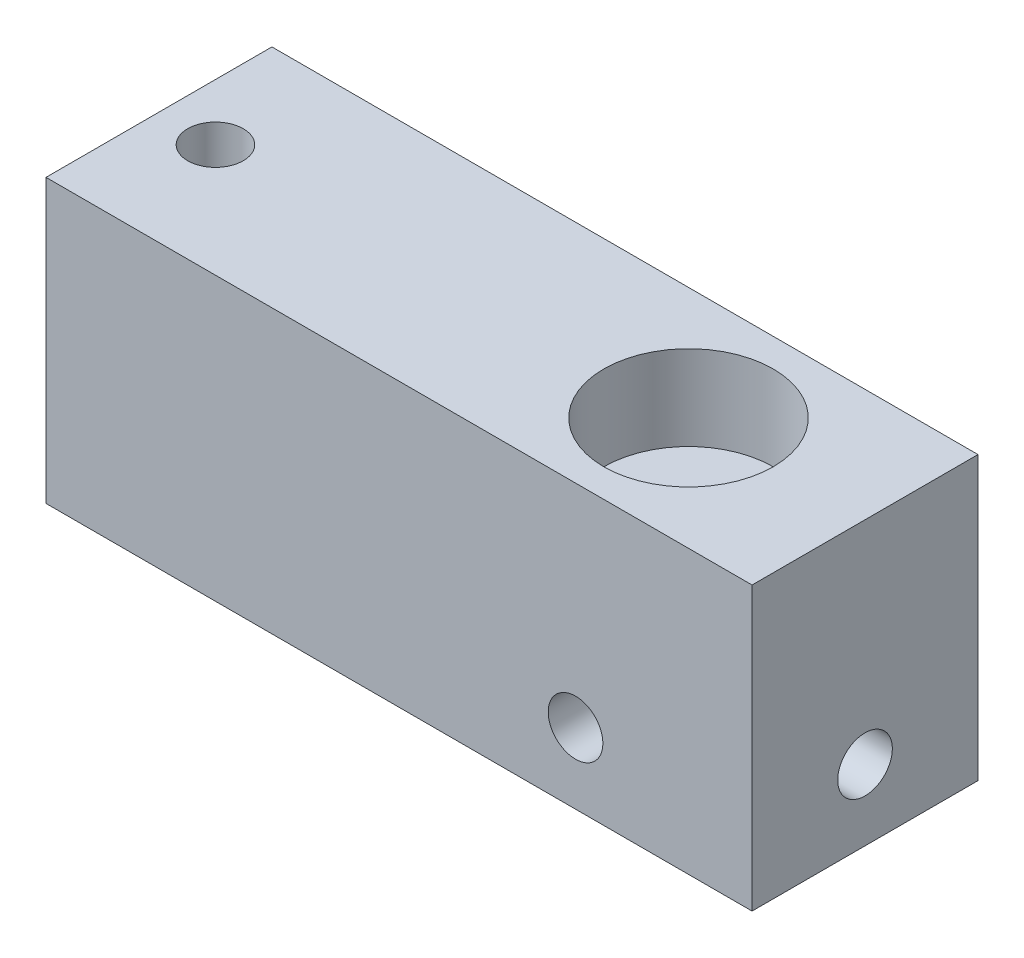
ISO-10303-21;
HEADER;
FILE_DESCRIPTION(('STEP AP214'),'2;1');
FILE_NAME('part.step','',(''),(''),'','','');
FILE_SCHEMA(('AUTOMOTIVE_DESIGN { 1 0 10303 214 1 1 1 1 }'));
ENDSEC;
DATA;
#1=APPLICATION_CONTEXT('core data for automotive mechanical design processes');
#2=APPLICATION_PROTOCOL_DEFINITION('international standard','automotive_design',2000,#1);
#3=PRODUCT_CONTEXT('',#1,'mechanical');
#4=PRODUCT('Part','Part','',(#3));
#5=PRODUCT_RELATED_PRODUCT_CATEGORY('part','',(#4));
#6=PRODUCT_DEFINITION_FORMATION('','',#4);
#7=PRODUCT_DEFINITION_CONTEXT('part definition',#1,'design');
#8=PRODUCT_DEFINITION('design','',#6,#7);
#9=PRODUCT_DEFINITION_SHAPE('','',#8);
#10=(LENGTH_UNIT() NAMED_UNIT(*) SI_UNIT(.MILLI.,.METRE.));
#11=(NAMED_UNIT(*) PLANE_ANGLE_UNIT() SI_UNIT($,.RADIAN.));
#12=(NAMED_UNIT(*) SI_UNIT($,.STERADIAN.) SOLID_ANGLE_UNIT());
#13=UNCERTAINTY_MEASURE_WITH_UNIT(LENGTH_MEASURE(1.E-05),#10,'distance_accuracy_value','');
#14=(GEOMETRIC_REPRESENTATION_CONTEXT(3) GLOBAL_UNCERTAINTY_ASSIGNED_CONTEXT((#13)) GLOBAL_UNIT_ASSIGNED_CONTEXT((#10,
#11,#12)) REPRESENTATION_CONTEXT('',''));
#15=CARTESIAN_POINT('',(0.,0.,0.));
#16=DIRECTION('',(0.,0.,1.));
#17=DIRECTION('',(1.,0.,0.));
#18=AXIS2_PLACEMENT_3D('',#15,#16,#17);
#19=CARTESIAN_POINT('',(-0.910267857142854,3.73883928571429,10.16));
#20=DIRECTION('',(0.,-1.,0.));
#21=DIRECTION('',(0.,0.,-1.));
#22=AXIS2_PLACEMENT_3D('',#19,#20,#21);
#23=CYLINDRICAL_SURFACE('',#22,3.175);
#24=CARTESIAN_POINT('',(1.54718214285713,-15.3111607142857,12.1703642698526));
#25=CARTESIAN_POINT('',(1.54718181275024,-15.3676823497579,12.1703649683734));
#26=CARTESIAN_POINT('',(1.54522514140633,-15.4242076252246,12.1727644340537));
#27=CARTESIAN_POINT('',(1.53747012279216,-15.5365927301839,12.1821861210722));
#28=CARTESIAN_POINT('',(1.53167120631298,-15.592452459831,12.1892090273483));
#29=CARTESIAN_POINT('',(1.50869830991297,-15.7585324479113,12.2166527041013));
#30=CARTESIAN_POINT('',(1.48594940627436,-15.8669726716601,12.2434451083172));
#31=CARTESIAN_POINT('',(1.42122419982478,-16.0990755275608,12.3158154149691));
#32=CARTESIAN_POINT('',(1.37614326257761,-16.220923100369,12.3642108288672));
#33=CARTESIAN_POINT('',(1.26954430286978,-16.4530054198774,12.4696954253262));
#34=CARTESIAN_POINT('',(1.20800628233574,-16.5632258088707,12.5267951485181));
#35=CARTESIAN_POINT('',(1.06790229818835,-16.7748638133818,12.645178735735));
#36=CARTESIAN_POINT('',(0.988927195336862,-16.8759695671223,12.7065334745517));
#37=CARTESIAN_POINT('',(0.815539303335605,-17.0653277578176,12.8270889669899));
#38=CARTESIAN_POINT('',(0.721138015496104,-17.1535896787724,12.8862912854954));
#39=CARTESIAN_POINT('',(0.521760241023555,-17.3121219252963,12.9958933587042));
#40=CARTESIAN_POINT('',(0.417432500968636,-17.3830133723543,13.0465659392274));
#41=CARTESIAN_POINT('',(0.195936098864364,-17.5092438739838,13.138466871536));
#42=CARTESIAN_POINT('',(0.0787797535257498,-17.5645976673465,13.1797041665821));
#43=CARTESIAN_POINT('',(-0.14759209202308,-17.6499021297176,13.2439289233957));
#44=CARTESIAN_POINT('',(-0.255311976421966,-17.6824338897152,13.2687367538486));
#45=CARTESIAN_POINT('',(-0.476096355974495,-17.7325948726575,13.30716458668));
#46=CARTESIAN_POINT('',(-0.589157354491618,-17.7502337065305,13.32079180414));
#47=CARTESIAN_POINT('',(-0.817798202355375,-17.7695557974694,13.3357254991741));
#48=CARTESIAN_POINT('',(-0.933384424817998,-17.7711924686407,13.3369960035208));
#49=CARTESIAN_POINT('',(-1.16310031506245,-17.7582762112873,13.3270052683012));
#50=CARTESIAN_POINT('',(-1.27722977294697,-17.7437209758075,13.31574224301));
#51=CARTESIAN_POINT('',(-1.49572235994868,-17.7003395955872,13.2824283262941));
#52=CARTESIAN_POINT('',(-1.60029429610973,-17.6721669451169,13.2608719334065));
#53=CARTESIAN_POINT('',(-1.80281173740431,-17.6032946275172,13.2087598596926));
#54=CARTESIAN_POINT('',(-1.90075569771828,-17.5625920521509,13.1782020896882));
#55=CARTESIAN_POINT('',(-2.09840787107985,-17.4654010966403,13.10637583643));
#56=CARTESIAN_POINT('',(-2.19723338097589,-17.4077085583546,13.064322362141));
#57=CARTESIAN_POINT('',(-2.38411648711467,-17.2808331353867,12.9741044526009));
#58=CARTESIAN_POINT('',(-2.4721662265054,-17.2116419524416,12.9259356100226));
#59=CARTESIAN_POINT('',(-2.65377850951626,-17.04812700028,12.8159781000162));
#60=CARTESIAN_POINT('',(-2.74483968305465,-16.9515518394978,12.7534080347511));
#61=CARTESIAN_POINT('',(-2.91037346971451,-16.7450973188708,12.6279898864689));
#62=CARTESIAN_POINT('',(-2.98483234117324,-16.6352070534094,12.5651416167352));
#63=CARTESIAN_POINT('',(-3.10546601838315,-16.4214198776669,12.455053633421));
#64=CARTESIAN_POINT('',(-3.15427252075817,-16.3194634354282,12.406939166591));
#65=CARTESIAN_POINT('',(-3.23826680723376,-16.1064724741469,12.319792384211));
#66=CARTESIAN_POINT('',(-3.27348504890555,-15.9954589414463,12.2807398360215));
#67=CARTESIAN_POINT('',(-3.32165504464854,-15.7931458110601,12.2256359596698));
#68=CARTESIAN_POINT('',(-3.33792951594114,-15.7035557822643,12.2063079675201));
#69=CARTESIAN_POINT('',(-3.36041494318394,-15.521446292728,12.1793385731337));
#70=CARTESIAN_POINT('',(-3.36664314363236,-15.4289321302829,12.1716771464191));
#71=CARTESIAN_POINT('',(-3.36853840123422,-15.2433734368542,12.1693620693368));
#72=CARTESIAN_POINT('',(-3.36417715394142,-15.1503281491021,12.1747432804578));
#73=CARTESIAN_POINT('',(-3.34522220233427,-14.9667662110988,12.1976032300238));
#74=CARTESIAN_POINT('',(-3.33061285881293,-14.8762536457542,12.2151004577082));
#75=CARTESIAN_POINT('',(-3.28587573723307,-14.6709158072219,12.2668000069231));
#76=CARTESIAN_POINT('',(-3.25224160738188,-14.5577837004325,12.3045886225015));
#77=CARTESIAN_POINT('',(-3.17094213953587,-14.3406254669564,12.3901263496192));
#78=CARTESIAN_POINT('',(-3.12323482130581,-14.2366278103736,12.4379051357969));
#79=CARTESIAN_POINT('',(-2.99636115029917,-14.0032827361763,12.5555545232503));
#80=CARTESIAN_POINT('',(-2.91202445057243,-13.8777040829759,12.6273278352968));
#81=CARTESIAN_POINT('',(-2.72180184216834,-13.6438018058425,12.7702025607316));
#82=CARTESIAN_POINT('',(-2.61592667788624,-13.5354696264048,12.8413042907027));
#83=CARTESIAN_POINT('',(-2.40281907822586,-13.3547797997635,12.9645371715887));
#84=CARTESIAN_POINT('',(-2.29881049376915,-13.279436090695,13.0178475885856));
#85=CARTESIAN_POINT('',(-2.07715957065448,-13.144552638518,13.1152630634093));
#86=CARTESIAN_POINT('',(-1.95953916682285,-13.0849879640301,13.1593826192387));
#87=CARTESIAN_POINT('',(-1.73273126550765,-12.992741108865,13.2285285117794));
#88=CARTESIAN_POINT('',(-1.62527784186029,-12.9572637798059,13.2554922262238));
#89=CARTESIAN_POINT('',(-1.4044045893124,-12.9012140057459,13.2983239604475));
#90=CARTESIAN_POINT('',(-1.29098804805586,-12.8806334382563,13.3141980267145));
#91=CARTESIAN_POINT('',(-1.0609125618707,-12.8555961496087,13.3335307489787));
#92=CARTESIAN_POINT('',(-0.94424375492629,-12.851195470467,13.3369462521315));
#93=CARTESIAN_POINT('',(-0.711798259285756,-12.8589793975095,13.3309228251952));
#94=CARTESIAN_POINT('',(-0.59602160329348,-12.8711646088066,13.321483426113));
#95=CARTESIAN_POINT('',(-0.375215260997357,-12.9101887809227,13.2914672844167));
#96=CARTESIAN_POINT('',(-0.269944724369463,-12.9361848559008,13.2715317026748));
#97=CARTESIAN_POINT('',(-0.0657076474663094,-13.0009083525549,13.2224152897288));
#98=CARTESIAN_POINT('',(0.0332574052026911,-13.0396387653696,13.193232286478));
#99=CARTESIAN_POINT('',(0.232178386727058,-13.1323949186795,13.124376465787));
#100=CARTESIAN_POINT('',(0.331372517150721,-13.1875072155717,13.0839810811025));
#101=CARTESIAN_POINT('',(0.519348676887477,-13.3092077651407,12.996824986875));
#102=CARTESIAN_POINT('',(0.608124091067142,-13.3758032432665,12.9500602735387));
#103=CARTESIAN_POINT('',(0.791342893161516,-13.5332574476837,12.8430052401881));
#104=CARTESIAN_POINT('',(0.883408866722775,-13.6263080805575,12.7818734993192));
#105=CARTESIAN_POINT('',(1.05153643664606,-13.8254291137312,12.6585622545501));
#106=CARTESIAN_POINT('',(1.12758292031463,-13.9315116602532,12.5963818205052));
#107=CARTESIAN_POINT('',(1.25513075678499,-14.1434264264437,12.4833767258052));
#108=CARTESIAN_POINT('',(1.30844326370184,-14.2479041738817,12.4320661195432));
#109=CARTESIAN_POINT('',(1.40060452304584,-14.4667706969318,12.3382567163752));
#110=CARTESIAN_POINT('',(1.43947607227724,-14.5811434970184,12.2957440782147));
#111=CARTESIAN_POINT('',(1.49500767753375,-14.79757333852,12.2328590689191));
#112=CARTESIAN_POINT('',(1.51441432397182,-14.8981133474535,12.2098722476481));
#113=CARTESIAN_POINT('',(1.53398870835175,-15.051658983825,12.1864078184885));
#114=CARTESIAN_POINT('',(1.53892409979709,-15.103256337521,12.1804226866419));
#115=CARTESIAN_POINT('',(1.54552024735433,-15.2069551561071,12.1724014608685));
#116=CARTESIAN_POINT('',(1.54718244716533,-15.2590563885577,12.1703636259231));
#117=CARTESIAN_POINT('',(1.54718214285713,-15.3111607142857,12.1703642698526));
#118=B_SPLINE_CURVE_WITH_KNOTS('',3,(#24,#25,#26,#27,#28,#29,#30,#31,#32,#33,#34,#35,#36,#37,
#38,#39,#40,#41,#42,#43,#44,#45,#46,#47,#48,#49,#50,#51,#52,#53,#54,#55,#56,#57,#58,#59,#60,#61,
#62,#63,#64,#65,#66,#67,#68,#69,#70,#71,#72,#73,#74,#75,#76,#77,#78,#79,#80,#81,#82,#83,#84,#85,
#86,#87,#88,#89,#90,#91,#92,#93,#94,#95,#96,#97,#98,#99,#100,#101,#102,#103,#104,#105,#106,#107,
#108,#109,#110,#111,#112,#113,#114,#115,#116,#117),.UNSPECIFIED.,.T.,.F.,(4,2,2,2,2,2,2,2,2,2,2,
2,2,2,2,2,2,2,2,2,2,2,2,2,2,2,2,2,2,2,2,2,2,2,2,2,2,2,2,2,2,2,2,2,2,2,4),(0.,0.169485062936671,
0.3389952398321,0.678841608818385,1.09256234605475,1.50678812483846,1.93202441328912,
2.35694509259097,2.7631540313288,3.16897633391103,3.51317462798851,3.8571506286712,
4.20212772372273,4.54715397595838,4.8770568685425,5.20703639048134,5.57145455308031,
5.93613685770948,6.37475343797258,6.81373172288627,7.18119024857467,7.54782027749966,
7.82595323378227,8.10360826278166,8.38200625016756,8.66083001639692,9.03054868934234,
9.40138157974831,9.90123236984671,10.400834419713,10.8164004558955,11.2313059142933,
11.5788100266513,11.9261245186815,12.2746408710013,12.6231699387899,12.9525283965772,
13.2819642719298,13.6419998512058,14.0022628043526,14.4340934255264,14.8663296265924,
15.2492122200182,15.6314877922239,15.9445817709082,16.1008901025948,16.2571294762702),.UNSPECIFIED.);
#119=CARTESIAN_POINT('',(1.33479617312565,-16.310534519473,12.4050640302661));
#120=VERTEX_POINT('',#119);
#121=CARTESIAN_POINT('',(1.33479617312443,-14.3117869090957,12.4050640302673));
#122=VERTEX_POINT('',#121);
#123=EDGE_CURVE('E11',#120,#122,#118,.T.);
#124=ORIENTED_EDGE('',*,*,#123,.F.);
#125=CARTESIAN_POINT('',(1.10009641270976,-15.3111607142857,7.70255000000001));
#126=CARTESIAN_POINT('',(1.1000971112305,-15.3676823497579,7.7025503301069));
#127=CARTESIAN_POINT('',(1.10249657691088,-15.4242076252246,7.70450700145081));
#128=CARTESIAN_POINT('',(1.11191826392931,-15.5365927301839,7.71226202006498));
#129=CARTESIAN_POINT('',(1.11894117020539,-15.592452459831,7.71806093654416));
#130=CARTESIAN_POINT('',(1.14638484695843,-15.7585324479113,7.74103383294417));
#131=CARTESIAN_POINT('',(1.17317725117438,-15.8669726716601,7.76378273658278));
#132=CARTESIAN_POINT('',(1.24554755782628,-16.0990755275608,7.82850794303236));
#133=CARTESIAN_POINT('',(1.29394297172437,-16.220923100369,7.87358888027953));
#134=CARTESIAN_POINT('',(1.39942756818333,-16.4530054198774,7.98018783998736));
#135=CARTESIAN_POINT('',(1.45652729137526,-16.5632258088707,8.0417258605214));
#136=CARTESIAN_POINT('',(1.57491087859215,-16.7748638133818,8.18182984466879));
#137=CARTESIAN_POINT('',(1.63626561740882,-16.8759695671223,8.26080494752028));
#138=CARTESIAN_POINT('',(1.75682110984703,-17.0653277578176,8.43419283952153));
#139=CARTESIAN_POINT('',(1.81602342835253,-17.1535896787724,8.52859412736103));
#140=CARTESIAN_POINT('',(1.92562550156129,-17.3121219252963,8.72797190183358));
#141=CARTESIAN_POINT('',(1.97629808208451,-17.3830133723543,8.8322996418885));
#142=CARTESIAN_POINT('',(2.06819901439313,-17.5092438739838,9.05379604399277));
#143=CARTESIAN_POINT('',(2.10943630943928,-17.5645976673465,9.17095238933139));
#144=CARTESIAN_POINT('',(2.17366106625282,-17.6499021297176,9.39732423488022));
#145=CARTESIAN_POINT('',(2.19846889670579,-17.6824338897152,9.5050441192791));
#146=CARTESIAN_POINT('',(2.23689672953717,-17.7325948726575,9.72582849883163));
#147=CARTESIAN_POINT('',(2.25052394699719,-17.7502337065305,9.83888949734875));
#148=CARTESIAN_POINT('',(2.26545764203122,-17.7695557974694,10.0675303452125));
#149=CARTESIAN_POINT('',(2.26672814637795,-17.7711924686408,10.1831165676751));
#150=CARTESIAN_POINT('',(2.25673741115833,-17.7582762112873,10.4128324579196));
#151=CARTESIAN_POINT('',(2.24547438586719,-17.7437209758076,10.5269619158041));
#152=CARTESIAN_POINT('',(2.2121604691513,-17.7003395955872,10.7454545028058));
#153=CARTESIAN_POINT('',(2.19060407626366,-17.6721669451169,10.8500264389669));
#154=CARTESIAN_POINT('',(2.13849200254978,-17.6032946275172,11.0525438802614));
#155=CARTESIAN_POINT('',(2.10793423254531,-17.5625920521509,11.1504878405754));
#156=CARTESIAN_POINT('',(2.03610797928717,-17.4654010966403,11.348140013937));
#157=CARTESIAN_POINT('',(1.99405450499812,-17.4077085583547,11.446965523833));
#158=CARTESIAN_POINT('',(1.90383659545809,-17.2808331353867,11.6338486299718));
#159=CARTESIAN_POINT('',(1.85566775287976,-17.2116419524416,11.7218983693625));
#160=CARTESIAN_POINT('',(1.74571024287337,-17.0481270002801,11.9035106523734));
#161=CARTESIAN_POINT('',(1.6831401776083,-16.9515518394978,11.9945718259118));
#162=CARTESIAN_POINT('',(1.55772202932604,-16.7450973188708,12.1601056125716));
#163=CARTESIAN_POINT('',(1.49487375959233,-16.6352070534094,12.2345644840304));
#164=CARTESIAN_POINT('',(1.38478577627814,-16.4214198776669,12.3551981612403));
#165=CARTESIAN_POINT('',(1.33667130944813,-16.3194634354282,12.4040046636153));
#166=CARTESIAN_POINT('',(1.24952452706812,-16.1064724741469,12.4879989500909));
#167=CARTESIAN_POINT('',(1.21047197887869,-15.9954589414463,12.5232171917627));
#168=CARTESIAN_POINT('',(1.15536810252695,-15.7931458110601,12.5713871875057));
#169=CARTESIAN_POINT('',(1.13604011037727,-15.7035557822644,12.5876616587983));
#170=CARTESIAN_POINT('',(1.10907071599082,-15.521446292728,12.6101470860411));
#171=CARTESIAN_POINT('',(1.10140928927625,-15.4289321302829,12.6163752864895));
#172=CARTESIAN_POINT('',(1.09909421219391,-15.2433734368542,12.6182705440914));
#173=CARTESIAN_POINT('',(1.10447542331495,-15.1503281491021,12.6139092967986));
#174=CARTESIAN_POINT('',(1.12733537288096,-14.9667662110989,12.5949543451914));
#175=CARTESIAN_POINT('',(1.14483260056537,-14.8762536457542,12.5803450016701));
#176=CARTESIAN_POINT('',(1.19653214978028,-14.6709158072219,12.5356078800902));
#177=CARTESIAN_POINT('',(1.2343207653586,-14.5577837004325,12.501973750239));
#178=CARTESIAN_POINT('',(1.31985849247633,-14.3406254669564,12.420674282393));
#179=CARTESIAN_POINT('',(1.36763727865404,-14.2366278103736,12.372966964163));
#180=CARTESIAN_POINT('',(1.4852866661074,-14.0032827361763,12.2460932931563));
#181=CARTESIAN_POINT('',(1.5570599781539,-13.8777040829759,12.1617565934296));
#182=CARTESIAN_POINT('',(1.69993470358877,-13.6438018058425,11.9715339850255));
#183=CARTESIAN_POINT('',(1.77103643355982,-13.5354696264048,11.8656588207434));
#184=CARTESIAN_POINT('',(1.8942693144458,-13.3547797997635,11.652551221083));
#185=CARTESIAN_POINT('',(1.9475797314427,-13.279436090695,11.5485426366263));
#186=CARTESIAN_POINT('',(2.04499520626648,-13.144552638518,11.3268917135116));
#187=CARTESIAN_POINT('',(2.08911476209588,-13.0849879640301,11.20927130968));
#188=CARTESIAN_POINT('',(2.15826065463649,-12.992741108865,10.9824634083648));
#189=CARTESIAN_POINT('',(2.18522436908093,-12.9572637798059,10.8750099847174));
#190=CARTESIAN_POINT('',(2.22805610330462,-12.9012140057459,10.6541367321696));
#191=CARTESIAN_POINT('',(2.24393016957162,-12.8806334382563,10.540720190913));
#192=CARTESIAN_POINT('',(2.26326289183585,-12.8555961496087,10.3106447047278));
#193=CARTESIAN_POINT('',(2.26667839498867,-12.851195470467,10.1939758977834));
#194=CARTESIAN_POINT('',(2.2606549680523,-12.8589793975095,9.96153040214291));
#195=CARTESIAN_POINT('',(2.25121556897011,-12.8711646088066,9.84575374615063));
#196=CARTESIAN_POINT('',(2.22119942727387,-12.9101887809227,9.62494740385451));
#197=CARTESIAN_POINT('',(2.20126384553199,-12.9361848559008,9.51967686722661));
#198=CARTESIAN_POINT('',(2.15214743258593,-13.0009083525549,9.31543979032346));
#199=CARTESIAN_POINT('',(2.12296442933514,-13.0396387653695,9.21647473765446));
#200=CARTESIAN_POINT('',(2.05410860864413,-13.1323949186795,9.01755375613009));
#201=CARTESIAN_POINT('',(2.01371322395964,-13.1875072155717,8.91835962570643));
#202=CARTESIAN_POINT('',(1.92655712973215,-13.3092077651407,8.73038346596967));
#203=CARTESIAN_POINT('',(1.87979241639589,-13.3758032432665,8.64160805179));
#204=CARTESIAN_POINT('',(1.7727373830452,-13.5332574476837,8.45838924969563));
#205=CARTESIAN_POINT('',(1.71160564217631,-13.6263080805575,8.36632327613437));
#206=CARTESIAN_POINT('',(1.58829439740727,-13.8254291137312,8.19819570621108));
#207=CARTESIAN_POINT('',(1.52611396336231,-13.9315116602532,8.12214922254251));
#208=CARTESIAN_POINT('',(1.41310886866237,-14.1434264264437,7.99460138607216));
#209=CARTESIAN_POINT('',(1.36179826240031,-14.2479041738817,7.9412888791553));
#210=CARTESIAN_POINT('',(1.26798885923234,-14.4667706969318,7.84912761981131));
#211=CARTESIAN_POINT('',(1.22547622107179,-14.5811434970183,7.8102560705799));
#212=CARTESIAN_POINT('',(1.16259121177627,-14.79757333852,7.75472446532339));
#213=CARTESIAN_POINT('',(1.13960439050523,-14.8981133474534,7.73531781888532));
#214=CARTESIAN_POINT('',(1.11613996134562,-15.051658983825,7.71574343450539));
#215=CARTESIAN_POINT('',(1.11015482949901,-15.103256337521,7.71080804306005));
#216=CARTESIAN_POINT('',(1.10213360372563,-15.2069551561071,7.70421189550281));
#217=CARTESIAN_POINT('',(1.1000957687802,-15.2590563885577,7.70254969569181));
#218=CARTESIAN_POINT('',(1.10009641270976,-15.3111607142857,7.70255000000001));
#219=B_SPLINE_CURVE_WITH_KNOTS('',3,(#125,#126,#127,#128,#129,#130,#131,#132,#133,#134,#135,
#136,#137,#138,#139,#140,#141,#142,#143,#144,#145,#146,#147,#148,#149,#150,#151,#152,#153,#154,
#155,#156,#157,#158,#159,#160,#161,#162,#163,#164,#165,#166,#167,#168,#169,#170,#171,#172,#173,
#174,#175,#176,#177,#178,#179,#180,#181,#182,#183,#184,#185,#186,#187,#188,#189,#190,#191,#192,
#193,#194,#195,#196,#197,#198,#199,#200,#201,#202,#203,#204,#205,#206,#207,#208,#209,#210,#211,
#212,#213,#214,#215,#216,#217,#218),.UNSPECIFIED.,.T.,.F.,(4,2,2,2,2,2,2,2,2,2,2,2,2,2,2,2,2,2,
2,2,2,2,2,2,2,2,2,2,2,2,2,2,2,2,2,2,2,2,2,2,2,2,2,2,2,2,4),(0.,0.16948506293667,
0.338995239832098,0.678841608818383,1.09256234605475,1.50678812483846,1.93202441328912,
2.35694509259097,2.76315403132881,3.16897633391103,3.51317462798851,3.8571506286712,
4.20212772372273,4.54715397595838,4.8770568685425,5.20703639048134,5.57145455308031,
5.93613685770949,6.37475343797259,6.81373172288627,7.18119024857467,7.54782027749966,
7.82595323378228,8.10360826278167,8.38200625016756,8.66083001639693,9.03054868934234,
9.40138157974832,9.90123236984672,10.400834419713,10.8164004558956,11.2313059142933,
11.5788100266513,11.9261245186816,12.2746408710013,12.6231699387899,12.9525283965772,
13.2819642719298,13.6419998512058,14.0022628043527,14.4340934255264,14.8663296265925,
15.2492122200182,15.6314877922239,15.9445817709082,16.1008901025948,16.2571294762703),.UNSPECIFIED.);
#220=EDGE_CURVE('E48',#122,#120,#219,.T.);
#221=ORIENTED_EDGE('',*,*,#220,.F.);
#222=EDGE_LOOP('',(#124,#221));
#223=FACE_BOUND('',#222,.T.);
#224=CARTESIAN_POINT('',(-0.910267857142854,-21.6611607142857,10.16));
#225=DIRECTION('',(0.,-1.,0.));
#226=DIRECTION('',(0.,0.,-1.));
#227=AXIS2_PLACEMENT_3D('',#224,#225,#226);
#228=CIRCLE('',#227,3.175);
#229=CARTESIAN_POINT('',(-0.910267857142854,-21.6611607142857,6.985));
#230=VERTEX_POINT('',#229);
#231=EDGE_CURVE('E112',#230,#230,#228,.T.);
#232=ORIENTED_EDGE('',*,*,#231,.T.);
#233=EDGE_LOOP('',(#232));
#234=FACE_BOUND('',#233,.T.);
#235=CARTESIAN_POINT('',(-0.910267857142854,-3.88116071428571,10.16));
#236=DIRECTION('',(0.,1.,0.));
#237=DIRECTION('',(0.,0.,1.));
#238=AXIS2_PLACEMENT_3D('',#235,#236,#237);
#239=CIRCLE('',#238,3.175);
#240=CARTESIAN_POINT('',(-0.910267857142854,-3.88116071428571,13.335));
#241=VERTEX_POINT('',#240);
#242=EDGE_CURVE('E37',#241,#241,#239,.F.);
#243=ORIENTED_EDGE('',*,*,#242,.F.);
#244=EDGE_LOOP('',(#243));
#245=FACE_BOUND('',#244,.T.);
#246=ADVANCED_FACE('F33',(#223,#234,#245),#23,.F.);
#247=CARTESIAN_POINT('',(-48.5352678571429,3.73883928571428,20.32));
#248=DIRECTION('',(1.,0.,0.));
#249=DIRECTION('',(0.,0.,-1.));
#250=AXIS2_PLACEMENT_3D('',#247,#248,#249);
#251=PLANE('',#250);
#252=DIRECTION('',(0.,-1.,0.));
#253=VECTOR('',#252,1.);
#254=CARTESIAN_POINT('',(-48.5352678571429,3.73883928571428,0.));
#255=LINE('',#254,#253);
#256=CARTESIAN_POINT('',(-48.5352678571429,3.73883928571428,0.));
#257=VERTEX_POINT('',#256);
#258=CARTESIAN_POINT('',(-48.5352678571429,-21.6611607142857,0.));
#259=VERTEX_POINT('',#258);
#260=EDGE_CURVE('E153',#257,#259,#255,.T.);
#261=ORIENTED_EDGE('',*,*,#260,.T.);
#262=DIRECTION('',(0.,0.,-1.));
#263=VECTOR('',#262,1.);
#264=CARTESIAN_POINT('',(-48.5352678571429,-21.6611607142857,20.32));
#265=LINE('',#264,#263);
#266=CARTESIAN_POINT('',(-48.5352678571429,-21.6611607142857,20.32));
#267=VERTEX_POINT('',#266);
#268=EDGE_CURVE('E138',#267,#259,#265,.T.);
#269=ORIENTED_EDGE('',*,*,#268,.F.);
#270=DIRECTION('',(0.,-1.,0.));
#271=VECTOR('',#270,1.);
#272=CARTESIAN_POINT('',(-48.5352678571429,3.73883928571428,20.32));
#273=LINE('',#272,#271);
#274=CARTESIAN_POINT('',(-48.5352678571429,3.73883928571428,20.32));
#275=VERTEX_POINT('',#274);
#276=EDGE_CURVE('E148',#275,#267,#273,.T.);
#277=ORIENTED_EDGE('',*,*,#276,.F.);
#278=DIRECTION('',(0.,0.,-1.));
#279=VECTOR('',#278,1.);
#280=CARTESIAN_POINT('',(-48.5352678571429,3.73883928571428,20.32));
#281=LINE('',#280,#279);
#282=EDGE_CURVE('E145',#275,#257,#281,.T.);
#283=ORIENTED_EDGE('',*,*,#282,.T.);
#284=EDGE_LOOP('',(#261,#269,#277,#283));
#285=FACE_BOUND('',#284,.T.);
#286=ADVANCED_FACE('F35',(#285),#251,.F.);
#287=CARTESIAN_POINT('',(-48.5352678571429,-21.6611607142857,20.32));
#288=DIRECTION('',(0.,1.,0.));
#289=DIRECTION('',(0.,0.,1.));
#290=AXIS2_PLACEMENT_3D('',#287,#288,#289);
#291=PLANE('',#290);
#292=ORIENTED_EDGE('',*,*,#231,.F.);
#293=EDGE_LOOP('',(#292));
#294=FACE_BOUND('',#293,.T.);
#295=DIRECTION('',(1.,0.,0.));
#296=VECTOR('',#295,1.);
#297=CARTESIAN_POINT('',(-48.5352678571429,-21.6611607142857,0.));
#298=LINE('',#297,#296);
#299=CARTESIAN_POINT('',(14.9647321428571,-21.6611607142857,0.));
#300=VERTEX_POINT('',#299);
#301=EDGE_CURVE('E151',#259,#300,#298,.T.);
#302=ORIENTED_EDGE('',*,*,#301,.T.);
#303=DIRECTION('',(0.,0.,-1.));
#304=VECTOR('',#303,1.);
#305=CARTESIAN_POINT('',(14.9647321428571,-21.6611607142857,20.32));
#306=LINE('',#305,#304);
#307=CARTESIAN_POINT('',(14.9647321428571,-21.6611607142857,20.32));
#308=VERTEX_POINT('',#307);
#309=EDGE_CURVE('E140',#308,#300,#306,.T.);
#310=ORIENTED_EDGE('',*,*,#309,.F.);
#311=DIRECTION('',(1.,0.,0.));
#312=VECTOR('',#311,1.);
#313=CARTESIAN_POINT('',(-48.5352678571429,-21.6611607142857,20.32));
#314=LINE('',#313,#312);
#315=EDGE_CURVE('E85',#267,#308,#314,.T.);
#316=ORIENTED_EDGE('',*,*,#315,.F.);
#317=ORIENTED_EDGE('',*,*,#268,.T.);
#318=EDGE_LOOP('',(#302,#310,#316,#317));
#319=FACE_BOUND('',#318,.T.);
#320=ADVANCED_FACE('F177',(#294,#319),#291,.F.);
#321=CARTESIAN_POINT('',(14.9647321428571,3.73883928571428,20.32));
#322=DIRECTION('',(-1.,0.,0.));
#323=DIRECTION('',(0.,-1.,0.));
#324=AXIS2_PLACEMENT_3D('',#321,#322,#323);
#325=PLANE('',#324);
#326=CARTESIAN_POINT('',(14.9647321428571,-15.3111607142857,10.16));
#327=DIRECTION('',(1.,0.,0.));
#328=DIRECTION('',(0.,0.,-1.));
#329=AXIS2_PLACEMENT_3D('',#326,#327,#328);
#330=CIRCLE('',#329,2.45744999999999);
#331=CARTESIAN_POINT('',(14.9647321428571,-15.3111607142857,7.70255000000001));
#332=VERTEX_POINT('',#331);
#333=EDGE_CURVE('E156',#332,#332,#330,.T.);
#334=ORIENTED_EDGE('',*,*,#333,.F.);
#335=EDGE_LOOP('',(#334));
#336=FACE_BOUND('',#335,.T.);
#337=DIRECTION('',(0.,1.,0.));
#338=VECTOR('',#337,1.);
#339=CARTESIAN_POINT('',(14.9647321428571,3.73883928571428,0.));
#340=LINE('',#339,#338);
#341=CARTESIAN_POINT('',(14.9647321428571,3.73883928571428,0.));
#342=VERTEX_POINT('',#341);
#343=EDGE_CURVE('E149',#300,#342,#340,.T.);
#344=ORIENTED_EDGE('',*,*,#343,.T.);
#345=DIRECTION('',(0.,0.,-1.));
#346=VECTOR('',#345,1.);
#347=CARTESIAN_POINT('',(14.9647321428571,3.73883928571428,20.32));
#348=LINE('',#347,#346);
#349=CARTESIAN_POINT('',(14.9647321428571,3.73883928571428,20.32));
#350=VERTEX_POINT('',#349);
#351=EDGE_CURVE('E143',#350,#342,#348,.T.);
#352=ORIENTED_EDGE('',*,*,#351,.F.);
#353=DIRECTION('',(0.,1.,0.));
#354=VECTOR('',#353,1.);
#355=CARTESIAN_POINT('',(14.9647321428571,3.73883928571428,20.32));
#356=LINE('',#355,#354);
#357=EDGE_CURVE('E158',#308,#350,#356,.T.);
#358=ORIENTED_EDGE('',*,*,#357,.F.);
#359=ORIENTED_EDGE('',*,*,#309,.T.);
#360=EDGE_LOOP('',(#344,#352,#358,#359));
#361=FACE_BOUND('',#360,.T.);
#362=ADVANCED_FACE('F182',(#336,#361),#325,.F.);
#363=CARTESIAN_POINT('',(-48.5352678571429,3.73883928571428,20.32));
#364=DIRECTION('',(0.,-1.,0.));
#365=DIRECTION('',(0.,0.,-1.));
#366=AXIS2_PLACEMENT_3D('',#363,#364,#365);
#367=PLANE('',#366);
#368=CARTESIAN_POINT('',(-43.4552678571429,3.73883928571428,10.16));
#369=DIRECTION('',(0.,1.,0.));
#370=DIRECTION('',(0.,0.,1.));
#371=AXIS2_PLACEMENT_3D('',#368,#369,#370);
#372=CIRCLE('',#371,2.5);
#373=CARTESIAN_POINT('',(-43.4552678571429,3.73883928571428,12.66));
#374=VERTEX_POINT('',#373);
#375=EDGE_CURVE('E102',#374,#374,#372,.T.);
#376=ORIENTED_EDGE('',*,*,#375,.F.);
#377=EDGE_LOOP('',(#376));
#378=FACE_BOUND('',#377,.T.);
#379=CARTESIAN_POINT('',(-0.910267857142858,3.73883928571428,10.16));
#380=DIRECTION('',(0.,1.,0.));
#381=DIRECTION('',(0.,0.,1.));
#382=AXIS2_PLACEMENT_3D('',#379,#380,#381);
#383=CIRCLE('',#382,7.62);
#384=CARTESIAN_POINT('',(-0.910267857142858,3.73883928571428,17.78));
#385=VERTEX_POINT('',#384);
#386=EDGE_CURVE('E101',#385,#385,#383,.T.);
#387=ORIENTED_EDGE('',*,*,#386,.F.);
#388=EDGE_LOOP('',(#387));
#389=FACE_BOUND('',#388,.T.);
#390=DIRECTION('',(-1.,0.,0.));
#391=VECTOR('',#390,1.);
#392=CARTESIAN_POINT('',(-48.5352678571429,3.73883928571428,0.));
#393=LINE('',#392,#391);
#394=EDGE_CURVE('E77',#342,#257,#393,.T.);
#395=ORIENTED_EDGE('',*,*,#394,.T.);
#396=ORIENTED_EDGE('',*,*,#282,.F.);
#397=DIRECTION('',(-1.,0.,0.));
#398=VECTOR('',#397,1.);
#399=CARTESIAN_POINT('',(-48.5352678571429,3.73883928571428,20.32));
#400=LINE('',#399,#398);
#401=EDGE_CURVE('E56',#350,#275,#400,.T.);
#402=ORIENTED_EDGE('',*,*,#401,.F.);
#403=ORIENTED_EDGE('',*,*,#351,.T.);
#404=EDGE_LOOP('',(#395,#396,#402,#403));
#405=FACE_BOUND('',#404,.T.);
#406=ADVANCED_FACE('F172',(#378,#389,#405),#367,.F.);
#407=CARTESIAN_POINT('',(0.,0.,20.32));
#408=DIRECTION('',(0.,0.,1.));
#409=DIRECTION('',(1.,0.,0.));
#410=AXIS2_PLACEMENT_3D('',#407,#408,#409);
#411=PLANE('',#410);
#412=CARTESIAN_POINT('',(-0.910267857142856,-15.3111607142857,20.32));
#413=DIRECTION('',(0.,0.,1.));
#414=DIRECTION('',(1.,0.,0.));
#415=AXIS2_PLACEMENT_3D('',#412,#413,#414);
#416=CIRCLE('',#415,2.45744999999999);
#417=CARTESIAN_POINT('',(1.54718214285713,-15.3111607142857,20.32));
#418=VERTEX_POINT('',#417);
#419=EDGE_CURVE('E120',#418,#418,#416,.T.);
#420=ORIENTED_EDGE('',*,*,#419,.F.);
#421=EDGE_LOOP('',(#420));
#422=FACE_BOUND('',#421,.T.);
#423=ORIENTED_EDGE('',*,*,#276,.T.);
#424=ORIENTED_EDGE('',*,*,#315,.T.);
#425=ORIENTED_EDGE('',*,*,#357,.T.);
#426=ORIENTED_EDGE('',*,*,#401,.T.);
#427=EDGE_LOOP('',(#423,#424,#425,#426));
#428=FACE_BOUND('',#427,.T.);
#429=ADVANCED_FACE('F169',(#422,#428),#411,.T.);
#430=CARTESIAN_POINT('',(0.,0.,0.));
#431=DIRECTION('',(0.,0.,1.));
#432=DIRECTION('',(1.,0.,0.));
#433=AXIS2_PLACEMENT_3D('',#430,#431,#432);
#434=PLANE('',#433);
#435=ORIENTED_EDGE('',*,*,#260,.F.);
#436=ORIENTED_EDGE('',*,*,#394,.F.);
#437=ORIENTED_EDGE('',*,*,#343,.F.);
#438=ORIENTED_EDGE('',*,*,#301,.F.);
#439=EDGE_LOOP('',(#435,#436,#437,#438));
#440=FACE_BOUND('',#439,.T.);
#441=ADVANCED_FACE('F171',(#440),#434,.F.);
#442=CARTESIAN_POINT('',(14.9647321428571,-15.3111607142857,10.16));
#443=DIRECTION('',(1.,0.,0.));
#444=DIRECTION('',(0.,0.,-1.));
#445=AXIS2_PLACEMENT_3D('',#442,#443,#444);
#446=CYLINDRICAL_SURFACE('',#445,2.45744999999999);
#447=CARTESIAN_POINT('',(-0.910267857142856,-15.3111607142857,10.16));
#448=DIRECTION('',(0.707106781186547,0.,-0.707106781186547));
#449=DIRECTION('',(0.707106781186547,0.,0.707106781186547));
#450=AXIS2_PLACEMENT_3D('',#447,#448,#449);
#451=ELLIPSE('',#450,3.47535911885375,2.45744999999999);
#452=EDGE_CURVE('E42',#120,#122,#451,.F.);
#453=ORIENTED_EDGE('',*,*,#452,.T.);
#454=ORIENTED_EDGE('',*,*,#220,.T.);
#455=EDGE_LOOP('',(#453,#454));
#456=FACE_BOUND('',#455,.T.);
#457=ORIENTED_EDGE('',*,*,#333,.T.);
#458=EDGE_LOOP('',(#457));
#459=FACE_BOUND('',#458,.T.);
#460=ADVANCED_FACE('F122',(#456,#459),#446,.F.);
#461=CARTESIAN_POINT('',(-0.910267857142856,-15.3111607142857,20.32));
#462=DIRECTION('',(0.,0.,1.));
#463=DIRECTION('',(1.,0.,0.));
#464=AXIS2_PLACEMENT_3D('',#461,#462,#463);
#465=CYLINDRICAL_SURFACE('',#464,2.45744999999999);
#466=ORIENTED_EDGE('',*,*,#419,.T.);
#467=EDGE_LOOP('',(#466));
#468=FACE_BOUND('',#467,.T.);
#469=ORIENTED_EDGE('',*,*,#452,.F.);
#470=ORIENTED_EDGE('',*,*,#123,.T.);
#471=EDGE_LOOP('',(#469,#470));
#472=FACE_BOUND('',#471,.T.);
#473=ADVANCED_FACE('F130',(#468,#472),#465,.F.);
#474=CARTESIAN_POINT('',(-0.910267857142858,-3.88116071428571,10.16));
#475=DIRECTION('',(0.,1.,0.));
#476=DIRECTION('',(0.,0.,1.));
#477=AXIS2_PLACEMENT_3D('',#474,#475,#476);
#478=PLANE('',#477);
#479=CARTESIAN_POINT('',(-0.910267857142858,-3.88116071428571,10.16));
#480=DIRECTION('',(0.,1.,0.));
#481=DIRECTION('',(0.,0.,1.));
#482=AXIS2_PLACEMENT_3D('',#479,#480,#481);
#483=CIRCLE('',#482,7.62);
#484=CARTESIAN_POINT('',(-0.910267857142858,-3.88116071428571,17.78));
#485=VERTEX_POINT('',#484);
#486=EDGE_CURVE('E105',#485,#485,#483,.T.);
#487=ORIENTED_EDGE('',*,*,#486,.T.);
#488=EDGE_LOOP('',(#487));
#489=FACE_BOUND('',#488,.T.);
#490=ORIENTED_EDGE('',*,*,#242,.T.);
#491=EDGE_LOOP('',(#490));
#492=FACE_BOUND('',#491,.T.);
#493=ADVANCED_FACE('F207',(#489,#492),#478,.T.);
#494=CARTESIAN_POINT('',(-0.910267857142858,-3.88116071428571,10.16));
#495=DIRECTION('',(0.,1.,0.));
#496=DIRECTION('',(0.,0.,1.));
#497=AXIS2_PLACEMENT_3D('',#494,#495,#496);
#498=CYLINDRICAL_SURFACE('',#497,7.62);
#499=ORIENTED_EDGE('',*,*,#486,.F.);
#500=EDGE_LOOP('',(#499));
#501=FACE_BOUND('',#500,.T.);
#502=ORIENTED_EDGE('',*,*,#386,.T.);
#503=EDGE_LOOP('',(#502));
#504=FACE_BOUND('',#503,.T.);
#505=ADVANCED_FACE('F95',(#501,#504),#498,.F.);
#506=CARTESIAN_POINT('',(-43.4552678571429,-12.2631607142857,10.16));
#507=DIRECTION('',(0.,1.,0.));
#508=DIRECTION('',(0.,0.,1.));
#509=AXIS2_PLACEMENT_3D('',#506,#507,#508);
#510=CONICAL_SURFACE('',#509,2.5,1.02974425867665);
#511=CARTESIAN_POINT('',(-43.4552678571429,-13.7653122618546,10.16));
#512=VERTEX_POINT('',#511);
#513=VERTEX_LOOP('',#512);
#514=FACE_BOUND('',#513,.T.);
#515=CARTESIAN_POINT('',(-43.4552678571429,-12.2631607142857,10.16));
#516=DIRECTION('',(0.,1.,0.));
#517=DIRECTION('',(0.,0.,1.));
#518=AXIS2_PLACEMENT_3D('',#515,#516,#517);
#519=CIRCLE('',#518,2.5);
#520=CARTESIAN_POINT('',(-43.4552678571429,-12.2631607142857,12.66));
#521=VERTEX_POINT('',#520);
#522=EDGE_CURVE('E99',#521,#521,#519,.T.);
#523=ORIENTED_EDGE('',*,*,#522,.T.);
#524=EDGE_LOOP('',(#523));
#525=FACE_BOUND('',#524,.T.);
#526=ADVANCED_FACE('F91',(#514,#525),#510,.F.);
#527=CARTESIAN_POINT('',(-43.4552678571429,3.73883928571428,10.16));
#528=DIRECTION('',(0.,1.,0.));
#529=DIRECTION('',(0.,0.,1.));
#530=AXIS2_PLACEMENT_3D('',#527,#528,#529);
#531=CYLINDRICAL_SURFACE('',#530,2.5);
#532=ORIENTED_EDGE('',*,*,#522,.F.);
#533=EDGE_LOOP('',(#532));
#534=FACE_BOUND('',#533,.T.);
#535=ORIENTED_EDGE('',*,*,#375,.T.);
#536=EDGE_LOOP('',(#535));
#537=FACE_BOUND('',#536,.T.);
#538=ADVANCED_FACE('F94',(#534,#537),#531,.F.);
#539=CLOSED_SHELL('',(#246,#286,#320,#362,#406,#429,#441,#460,#473,#493,#505,#526,#538));
#540=MANIFOLD_SOLID_BREP('B2',#539);
#541=ADVANCED_BREP_SHAPE_REPRESENTATION('',(#18,#540),#14);
#542=SHAPE_DEFINITION_REPRESENTATION(#9,#541);
ENDSEC;
END-ISO-10303-21;
